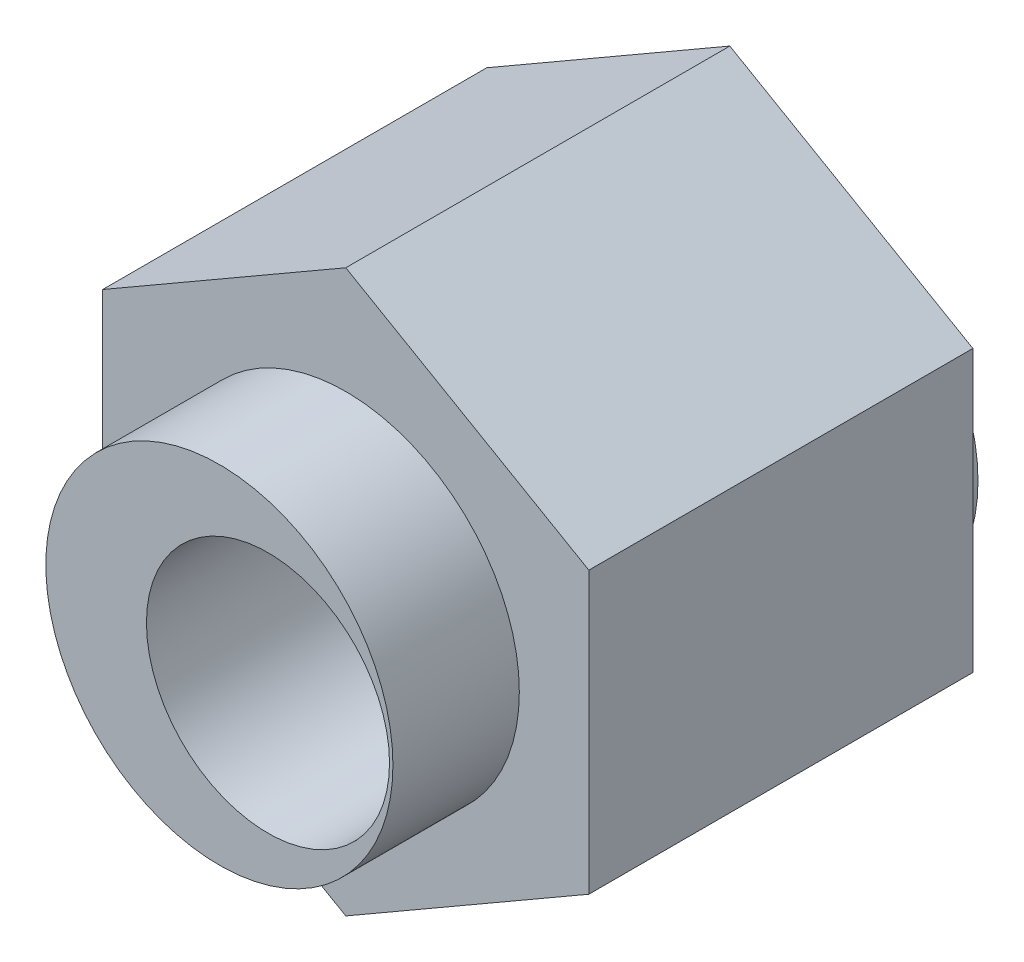
ISO-10303-21;
HEADER;
FILE_DESCRIPTION(('STEP AP214'),'2;1');
FILE_NAME('part.step','',(''),(''),'','','');
FILE_SCHEMA(('AUTOMOTIVE_DESIGN { 1 0 10303 214 1 1 1 1 }'));
ENDSEC;
DATA;
#1=APPLICATION_CONTEXT('core data for automotive mechanical design processes');
#2=APPLICATION_PROTOCOL_DEFINITION('international standard','automotive_design',2000,#1);
#3=PRODUCT_CONTEXT('',#1,'mechanical');
#4=PRODUCT('Part','Part','',(#3));
#5=PRODUCT_RELATED_PRODUCT_CATEGORY('part','',(#4));
#6=PRODUCT_DEFINITION_FORMATION('','',#4);
#7=PRODUCT_DEFINITION_CONTEXT('part definition',#1,'design');
#8=PRODUCT_DEFINITION('design','',#6,#7);
#9=PRODUCT_DEFINITION_SHAPE('','',#8);
#10=(LENGTH_UNIT() NAMED_UNIT(*) SI_UNIT(.MILLI.,.METRE.));
#11=(NAMED_UNIT(*) PLANE_ANGLE_UNIT() SI_UNIT($,.RADIAN.));
#12=(NAMED_UNIT(*) SI_UNIT($,.STERADIAN.) SOLID_ANGLE_UNIT());
#13=UNCERTAINTY_MEASURE_WITH_UNIT(LENGTH_MEASURE(1.E-05),#10,'distance_accuracy_value','');
#14=(GEOMETRIC_REPRESENTATION_CONTEXT(3) GLOBAL_UNCERTAINTY_ASSIGNED_CONTEXT((#13)) GLOBAL_UNIT_ASSIGNED_CONTEXT((#10,
#11,#12)) REPRESENTATION_CONTEXT('',''));
#15=CARTESIAN_POINT('',(0.,0.,0.));
#16=DIRECTION('',(0.,0.,1.));
#17=DIRECTION('',(1.,0.,0.));
#18=AXIS2_PLACEMENT_3D('',#15,#16,#17);
#19=CARTESIAN_POINT('',(0.,0.,7.9));
#20=DIRECTION('',(0.,0.,1.));
#21=DIRECTION('',(1.,0.,0.));
#22=AXIS2_PLACEMENT_3D('',#19,#20,#21);
#23=PLANE('',#22);
#24=CARTESIAN_POINT('',(0.,0.,7.9));
#25=DIRECTION('',(0.,0.,-1.));
#26=DIRECTION('',(-1.,0.,0.));
#27=AXIS2_PLACEMENT_3D('',#24,#25,#26);
#28=CIRCLE('',#27,3.57);
#29=CARTESIAN_POINT('',(3.57,0.,7.9));
#30=VERTEX_POINT('',#29);
#31=EDGE_CURVE('E188',#30,#30,#28,.T.);
#32=ORIENTED_EDGE('',*,*,#31,.T.);
#33=EDGE_LOOP('',(#32));
#34=FACE_BOUND('',#33,.T.);
#35=DIRECTION('',(-0.866025403784439,0.5,0.));
#36=VECTOR('',#35,1.);
#37=CARTESIAN_POINT('',(5.,2.88675134594813,7.9));
#38=LINE('',#37,#36);
#39=CARTESIAN_POINT('',(5.,2.88675134594813,7.9));
#40=VERTEX_POINT('',#39);
#41=CARTESIAN_POINT('',(0.,5.77350269189626,7.9));
#42=VERTEX_POINT('',#41);
#43=EDGE_CURVE('E11',#40,#42,#38,.T.);
#44=ORIENTED_EDGE('',*,*,#43,.T.);
#45=DIRECTION('',(-0.866025403784439,-0.5,0.));
#46=VECTOR('',#45,1.);
#47=CARTESIAN_POINT('',(0.,5.77350269189626,7.9));
#48=LINE('',#47,#46);
#49=CARTESIAN_POINT('',(-5.,2.88675134594816,7.9));
#50=VERTEX_POINT('',#49);
#51=EDGE_CURVE('E151',#42,#50,#48,.T.);
#52=ORIENTED_EDGE('',*,*,#51,.T.);
#53=DIRECTION('',(0.,-1.,0.));
#54=VECTOR('',#53,1.);
#55=CARTESIAN_POINT('',(-5.,2.88675134594816,7.9));
#56=LINE('',#55,#54);
#57=CARTESIAN_POINT('',(-5.,-2.88675134594814,7.9));
#58=VERTEX_POINT('',#57);
#59=EDGE_CURVE('E171',#50,#58,#56,.T.);
#60=ORIENTED_EDGE('',*,*,#59,.T.);
#61=DIRECTION('',(0.866025403784439,-0.5,0.));
#62=VECTOR('',#61,1.);
#63=CARTESIAN_POINT('',(-5.,-2.88675134594814,7.9));
#64=LINE('',#63,#62);
#65=CARTESIAN_POINT('',(0.,-5.77350269189624,7.9));
#66=VERTEX_POINT('',#65);
#67=EDGE_CURVE('E122',#58,#66,#64,.T.);
#68=ORIENTED_EDGE('',*,*,#67,.T.);
#69=DIRECTION('',(0.866025403784439,0.5,0.));
#70=VECTOR('',#69,1.);
#71=CARTESIAN_POINT('',(0.,-5.77350269189624,7.9));
#72=LINE('',#71,#70);
#73=CARTESIAN_POINT('',(5.,-2.88675134594811,7.9));
#74=VERTEX_POINT('',#73);
#75=EDGE_CURVE('E91',#66,#74,#72,.T.);
#76=ORIENTED_EDGE('',*,*,#75,.T.);
#77=DIRECTION('',(0.,1.,0.));
#78=VECTOR('',#77,1.);
#79=CARTESIAN_POINT('',(5.,-2.88675134594811,7.9));
#80=LINE('',#79,#78);
#81=EDGE_CURVE('E167',#74,#40,#80,.T.);
#82=ORIENTED_EDGE('',*,*,#81,.T.);
#83=EDGE_LOOP('',(#44,#52,#60,#68,#76,#82));
#84=FACE_BOUND('',#83,.T.);
#85=ADVANCED_FACE('F16',(#34,#84),#23,.T.);
#86=CARTESIAN_POINT('',(5.,2.88675134594813,0.));
#87=DIRECTION('',(0.5,0.866025403784439,0.));
#88=DIRECTION('',(0.,0.,-1.));
#89=AXIS2_PLACEMENT_3D('',#86,#87,#88);
#90=PLANE('',#89);
#91=DIRECTION('',(-0.866025403784439,0.5,0.));
#92=VECTOR('',#91,1.);
#93=CARTESIAN_POINT('',(5.,2.88675134594813,0.));
#94=LINE('',#93,#92);
#95=CARTESIAN_POINT('',(5.,2.88675134594813,0.));
#96=VERTEX_POINT('',#95);
#97=CARTESIAN_POINT('',(0.,5.77350269189626,0.));
#98=VERTEX_POINT('',#97);
#99=EDGE_CURVE('E143',#96,#98,#94,.T.);
#100=ORIENTED_EDGE('',*,*,#99,.T.);
#101=DIRECTION('',(0.,0.,1.));
#102=VECTOR('',#101,1.);
#103=CARTESIAN_POINT('',(0.,5.77350269189626,0.));
#104=LINE('',#103,#102);
#105=EDGE_CURVE('E20',#98,#42,#104,.T.);
#106=ORIENTED_EDGE('',*,*,#105,.T.);
#107=ORIENTED_EDGE('',*,*,#43,.F.);
#108=DIRECTION('',(0.,0.,1.));
#109=VECTOR('',#108,1.);
#110=CARTESIAN_POINT('',(5.,2.88675134594813,0.));
#111=LINE('',#110,#109);
#112=EDGE_CURVE('E170',#96,#40,#111,.T.);
#113=ORIENTED_EDGE('',*,*,#112,.F.);
#114=EDGE_LOOP('',(#100,#106,#107,#113));
#115=FACE_BOUND('',#114,.T.);
#116=ADVANCED_FACE('F222',(#115),#90,.T.);
#117=CARTESIAN_POINT('',(0.,5.77350269189626,0.));
#118=DIRECTION('',(-0.5,0.866025403784439,0.));
#119=DIRECTION('',(0.,0.,1.));
#120=AXIS2_PLACEMENT_3D('',#117,#118,#119);
#121=PLANE('',#120);
#122=DIRECTION('',(-0.866025403784439,-0.5,0.));
#123=VECTOR('',#122,1.);
#124=CARTESIAN_POINT('',(0.,5.77350269189626,0.));
#125=LINE('',#124,#123);
#126=CARTESIAN_POINT('',(-5.,2.88675134594816,0.));
#127=VERTEX_POINT('',#126);
#128=EDGE_CURVE('E147',#98,#127,#125,.T.);
#129=ORIENTED_EDGE('',*,*,#128,.T.);
#130=DIRECTION('',(0.,0.,1.));
#131=VECTOR('',#130,1.);
#132=CARTESIAN_POINT('',(-5.,2.88675134594816,0.));
#133=LINE('',#132,#131);
#134=EDGE_CURVE('E153',#127,#50,#133,.T.);
#135=ORIENTED_EDGE('',*,*,#134,.T.);
#136=ORIENTED_EDGE('',*,*,#51,.F.);
#137=ORIENTED_EDGE('',*,*,#105,.F.);
#138=EDGE_LOOP('',(#129,#135,#136,#137));
#139=FACE_BOUND('',#138,.T.);
#140=ADVANCED_FACE('F225',(#139),#121,.T.);
#141=CARTESIAN_POINT('',(-5.,2.88675134594816,0.));
#142=DIRECTION('',(-1.,0.,0.));
#143=DIRECTION('',(0.,0.,1.));
#144=AXIS2_PLACEMENT_3D('',#141,#142,#143);
#145=PLANE('',#144);
#146=DIRECTION('',(0.,-1.,0.));
#147=VECTOR('',#146,1.);
#148=CARTESIAN_POINT('',(-5.,2.88675134594816,0.));
#149=LINE('',#148,#147);
#150=CARTESIAN_POINT('',(-5.,-2.88675134594814,0.));
#151=VERTEX_POINT('',#150);
#152=EDGE_CURVE('E133',#127,#151,#149,.T.);
#153=ORIENTED_EDGE('',*,*,#152,.T.);
#154=DIRECTION('',(0.,0.,1.));
#155=VECTOR('',#154,1.);
#156=CARTESIAN_POINT('',(-5.,-2.88675134594814,0.));
#157=LINE('',#156,#155);
#158=EDGE_CURVE('E128',#151,#58,#157,.T.);
#159=ORIENTED_EDGE('',*,*,#158,.T.);
#160=ORIENTED_EDGE('',*,*,#59,.F.);
#161=ORIENTED_EDGE('',*,*,#134,.F.);
#162=EDGE_LOOP('',(#153,#159,#160,#161));
#163=FACE_BOUND('',#162,.T.);
#164=ADVANCED_FACE('F227',(#163),#145,.T.);
#165=CARTESIAN_POINT('',(-5.,-2.88675134594814,0.));
#166=DIRECTION('',(-0.5,-0.866025403784439,0.));
#167=DIRECTION('',(-0.866025403784439,0.5,0.));
#168=AXIS2_PLACEMENT_3D('',#165,#166,#167);
#169=PLANE('',#168);
#170=DIRECTION('',(0.866025403784439,-0.5,0.));
#171=VECTOR('',#170,1.);
#172=CARTESIAN_POINT('',(-5.,-2.88675134594814,0.));
#173=LINE('',#172,#171);
#174=CARTESIAN_POINT('',(0.,-5.77350269189624,0.));
#175=VERTEX_POINT('',#174);
#176=EDGE_CURVE('E125',#151,#175,#173,.T.);
#177=ORIENTED_EDGE('',*,*,#176,.T.);
#178=DIRECTION('',(0.,0.,1.));
#179=VECTOR('',#178,1.);
#180=CARTESIAN_POINT('',(0.,-5.77350269189624,0.));
#181=LINE('',#180,#179);
#182=EDGE_CURVE('E113',#175,#66,#181,.T.);
#183=ORIENTED_EDGE('',*,*,#182,.T.);
#184=ORIENTED_EDGE('',*,*,#67,.F.);
#185=ORIENTED_EDGE('',*,*,#158,.F.);
#186=EDGE_LOOP('',(#177,#183,#184,#185));
#187=FACE_BOUND('',#186,.T.);
#188=ADVANCED_FACE('F126',(#187),#169,.T.);
#189=CARTESIAN_POINT('',(0.,-5.77350269189624,0.));
#190=DIRECTION('',(0.5,-0.866025403784439,0.));
#191=DIRECTION('',(0.,0.,-1.));
#192=AXIS2_PLACEMENT_3D('',#189,#190,#191);
#193=PLANE('',#192);
#194=DIRECTION('',(0.866025403784439,0.5,0.));
#195=VECTOR('',#194,1.);
#196=CARTESIAN_POINT('',(0.,-5.77350269189624,0.));
#197=LINE('',#196,#195);
#198=CARTESIAN_POINT('',(5.,-2.88675134594811,0.));
#199=VERTEX_POINT('',#198);
#200=EDGE_CURVE('E117',#175,#199,#197,.T.);
#201=ORIENTED_EDGE('',*,*,#200,.T.);
#202=DIRECTION('',(0.,0.,1.));
#203=VECTOR('',#202,1.);
#204=CARTESIAN_POINT('',(5.,-2.88675134594811,0.));
#205=LINE('',#204,#203);
#206=EDGE_CURVE('E106',#199,#74,#205,.T.);
#207=ORIENTED_EDGE('',*,*,#206,.T.);
#208=ORIENTED_EDGE('',*,*,#75,.F.);
#209=ORIENTED_EDGE('',*,*,#182,.F.);
#210=EDGE_LOOP('',(#201,#207,#208,#209));
#211=FACE_BOUND('',#210,.T.);
#212=ADVANCED_FACE('F115',(#211),#193,.T.);
#213=CARTESIAN_POINT('',(5.,-2.88675134594811,0.));
#214=DIRECTION('',(1.,0.,0.));
#215=DIRECTION('',(0.,-1.,0.));
#216=AXIS2_PLACEMENT_3D('',#213,#214,#215);
#217=PLANE('',#216);
#218=DIRECTION('',(0.,1.,0.));
#219=VECTOR('',#218,1.);
#220=CARTESIAN_POINT('',(5.,-2.88675134594811,0.));
#221=LINE('',#220,#219);
#222=EDGE_CURVE('E136',#199,#96,#221,.T.);
#223=ORIENTED_EDGE('',*,*,#222,.T.);
#224=ORIENTED_EDGE('',*,*,#112,.T.);
#225=ORIENTED_EDGE('',*,*,#81,.F.);
#226=ORIENTED_EDGE('',*,*,#206,.F.);
#227=EDGE_LOOP('',(#223,#224,#225,#226));
#228=FACE_BOUND('',#227,.T.);
#229=ADVANCED_FACE('F221',(#228),#217,.T.);
#230=CARTESIAN_POINT('',(0.,0.,0.));
#231=DIRECTION('',(0.,0.,1.));
#232=DIRECTION('',(1.,0.,0.));
#233=AXIS2_PLACEMENT_3D('',#230,#231,#232);
#234=PLANE('',#233);
#235=CARTESIAN_POINT('',(0.999999999999984,0.,0.));
#236=DIRECTION('',(0.,0.,1.));
#237=DIRECTION('',(1.,0.,0.));
#238=AXIS2_PLACEMENT_3D('',#235,#236,#237);
#239=CIRCLE('',#238,3.525);
#240=CARTESIAN_POINT('',(-2.525,0.,0.));
#241=VERTEX_POINT('',#240);
#242=EDGE_CURVE('E158',#241,#241,#239,.T.);
#243=ORIENTED_EDGE('',*,*,#242,.T.);
#244=EDGE_LOOP('',(#243));
#245=FACE_BOUND('',#244,.T.);
#246=ORIENTED_EDGE('',*,*,#99,.F.);
#247=ORIENTED_EDGE('',*,*,#222,.F.);
#248=ORIENTED_EDGE('',*,*,#200,.F.);
#249=ORIENTED_EDGE('',*,*,#176,.F.);
#250=ORIENTED_EDGE('',*,*,#152,.F.);
#251=ORIENTED_EDGE('',*,*,#128,.F.);
#252=EDGE_LOOP('',(#246,#247,#248,#249,#250,#251));
#253=FACE_BOUND('',#252,.T.);
#254=ADVANCED_FACE('F18',(#245,#253),#234,.F.);
#255=CARTESIAN_POINT('',(0.999999999999984,0.,-0.58));
#256=DIRECTION('',(0.,0.,1.));
#257=DIRECTION('',(1.,0.,0.));
#258=AXIS2_PLACEMENT_3D('',#255,#256,#257);
#259=PLANE('',#258);
#260=CARTESIAN_POINT('',(0.999999999999984,0.,-0.58));
#261=DIRECTION('',(0.,0.,1.));
#262=DIRECTION('',(1.,0.,0.));
#263=AXIS2_PLACEMENT_3D('',#260,#261,#262);
#264=CIRCLE('',#263,2.5);
#265=CARTESIAN_POINT('',(-1.5,0.,-0.58));
#266=VERTEX_POINT('',#265);
#267=EDGE_CURVE('E165',#266,#266,#264,.T.);
#268=ORIENTED_EDGE('',*,*,#267,.T.);
#269=EDGE_LOOP('',(#268));
#270=FACE_BOUND('',#269,.T.);
#271=CARTESIAN_POINT('',(0.999999999999984,0.,-0.58));
#272=DIRECTION('',(0.,0.,-1.));
#273=DIRECTION('',(1.,0.,0.));
#274=AXIS2_PLACEMENT_3D('',#271,#272,#273);
#275=CIRCLE('',#274,3.525);
#276=CARTESIAN_POINT('',(-2.525,0.,-0.58));
#277=VERTEX_POINT('',#276);
#278=EDGE_CURVE('E177',#277,#277,#275,.T.);
#279=ORIENTED_EDGE('',*,*,#278,.T.);
#280=EDGE_LOOP('',(#279));
#281=FACE_BOUND('',#280,.T.);
#282=ADVANCED_FACE('F254',(#270,#281),#259,.F.);
#283=CARTESIAN_POINT('',(0.999999999999984,0.,0.));
#284=DIRECTION('',(0.,0.,-1.));
#285=DIRECTION('',(1.,0.,0.));
#286=AXIS2_PLACEMENT_3D('',#283,#284,#285);
#287=CYLINDRICAL_SURFACE('',#286,3.525);
#288=ORIENTED_EDGE('',*,*,#278,.F.);
#289=DIRECTION('',(0.,0.,1.));
#290=VECTOR('',#289,1.);
#291=CARTESIAN_POINT('',(-2.525,0.,0.));
#292=LINE('',#291,#290);
#293=EDGE_CURVE('E181',#277,#241,#292,.T.);
#294=ORIENTED_EDGE('',*,*,#293,.T.);
#295=ORIENTED_EDGE('',*,*,#242,.F.);
#296=ORIENTED_EDGE('',*,*,#293,.F.);
#297=EDGE_LOOP('',(#288,#294,#295,#296));
#298=FACE_BOUND('',#297,.T.);
#299=ADVANCED_FACE('F250',(#298),#287,.T.);
#300=CARTESIAN_POINT('',(0.999999999999984,0.,0.));
#301=DIRECTION('',(0.,0.,-1.));
#302=DIRECTION('',(1.,0.,0.));
#303=AXIS2_PLACEMENT_3D('',#300,#301,#302);
#304=CYLINDRICAL_SURFACE('',#303,2.5);
#305=CARTESIAN_POINT('',(0.999999999999984,0.,10.5));
#306=DIRECTION('',(0.,0.,-1.));
#307=DIRECTION('',(-1.,0.,0.));
#308=AXIS2_PLACEMENT_3D('',#305,#306,#307);
#309=CIRCLE('',#308,2.5);
#310=CARTESIAN_POINT('',(-1.5,0.,10.5));
#311=VERTEX_POINT('',#310);
#312=EDGE_CURVE('E166',#311,#311,#309,.T.);
#313=ORIENTED_EDGE('',*,*,#312,.F.);
#314=DIRECTION('',(0.,0.,-1.));
#315=VECTOR('',#314,1.);
#316=CARTESIAN_POINT('',(-1.5,0.,0.));
#317=LINE('',#316,#315);
#318=EDGE_CURVE('E161',#311,#266,#317,.T.);
#319=ORIENTED_EDGE('',*,*,#318,.T.);
#320=ORIENTED_EDGE('',*,*,#267,.F.);
#321=ORIENTED_EDGE('',*,*,#318,.F.);
#322=EDGE_LOOP('',(#313,#319,#320,#321));
#323=FACE_BOUND('',#322,.T.);
#324=ADVANCED_FACE('F253',(#323),#304,.F.);
#325=CARTESIAN_POINT('',(0.,0.,10.5));
#326=DIRECTION('',(0.,0.,1.));
#327=DIRECTION('',(1.,0.,0.));
#328=AXIS2_PLACEMENT_3D('',#325,#326,#327);
#329=PLANE('',#328);
#330=ORIENTED_EDGE('',*,*,#312,.T.);
#331=EDGE_LOOP('',(#330));
#332=FACE_BOUND('',#331,.T.);
#333=CARTESIAN_POINT('',(0.,0.,10.5));
#334=DIRECTION('',(0.,0.,1.));
#335=DIRECTION('',(-1.,0.,0.));
#336=AXIS2_PLACEMENT_3D('',#333,#334,#335);
#337=CIRCLE('',#336,3.57);
#338=CARTESIAN_POINT('',(3.57,0.,10.5));
#339=VERTEX_POINT('',#338);
#340=EDGE_CURVE('E189',#339,#339,#337,.T.);
#341=ORIENTED_EDGE('',*,*,#340,.T.);
#342=EDGE_LOOP('',(#341));
#343=FACE_BOUND('',#342,.T.);
#344=ADVANCED_FACE('F258',(#332,#343),#329,.T.);
#345=CARTESIAN_POINT('',(0.,0.,7.9));
#346=DIRECTION('',(0.,0.,1.));
#347=DIRECTION('',(-1.,0.,0.));
#348=AXIS2_PLACEMENT_3D('',#345,#346,#347);
#349=CYLINDRICAL_SURFACE('',#348,3.57);
#350=ORIENTED_EDGE('',*,*,#340,.F.);
#351=DIRECTION('',(0.,0.,-1.));
#352=VECTOR('',#351,1.);
#353=CARTESIAN_POINT('',(3.57,0.,7.9));
#354=LINE('',#353,#352);
#355=EDGE_CURVE('E184',#339,#30,#354,.T.);
#356=ORIENTED_EDGE('',*,*,#355,.T.);
#357=ORIENTED_EDGE('',*,*,#31,.F.);
#358=ORIENTED_EDGE('',*,*,#355,.F.);
#359=EDGE_LOOP('',(#350,#356,#357,#358));
#360=FACE_BOUND('',#359,.T.);
#361=ADVANCED_FACE('F256',(#360),#349,.T.);
#362=CLOSED_SHELL('',(#85,#116,#140,#164,#188,#212,#229,#254,#282,#299,#324,#344,#361));
#363=MANIFOLD_SOLID_BREP('B1',#362);
#364=ADVANCED_BREP_SHAPE_REPRESENTATION('',(#18,#363),#14);
#365=SHAPE_DEFINITION_REPRESENTATION(#9,#364);
ENDSEC;
END-ISO-10303-21;
